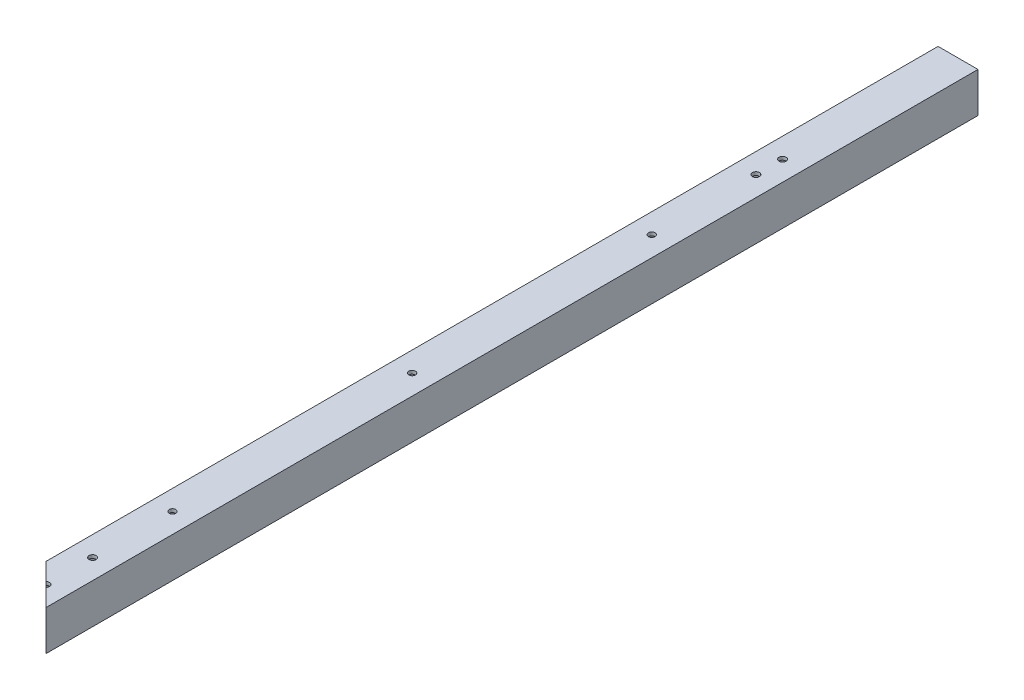
ISO-10303-21;
HEADER;
FILE_DESCRIPTION(('STEP AP214'),'2;1');
FILE_NAME('part.step','',(''),(''),'','','');
FILE_SCHEMA(('AUTOMOTIVE_DESIGN { 1 0 10303 214 1 1 1 1 }'));
ENDSEC;
DATA;
#1=APPLICATION_CONTEXT('core data for automotive mechanical design processes');
#2=APPLICATION_PROTOCOL_DEFINITION('international standard','automotive_design',2000,#1);
#3=PRODUCT_CONTEXT('',#1,'mechanical');
#4=PRODUCT('Part','Part','',(#3));
#5=PRODUCT_RELATED_PRODUCT_CATEGORY('part','',(#4));
#6=PRODUCT_DEFINITION_FORMATION('','',#4);
#7=PRODUCT_DEFINITION_CONTEXT('part definition',#1,'design');
#8=PRODUCT_DEFINITION('design','',#6,#7);
#9=PRODUCT_DEFINITION_SHAPE('','',#8);
#10=(LENGTH_UNIT() NAMED_UNIT(*) SI_UNIT(.MILLI.,.METRE.));
#11=(NAMED_UNIT(*) PLANE_ANGLE_UNIT() SI_UNIT($,.RADIAN.));
#12=(NAMED_UNIT(*) SI_UNIT($,.STERADIAN.) SOLID_ANGLE_UNIT());
#13=UNCERTAINTY_MEASURE_WITH_UNIT(LENGTH_MEASURE(1.E-05),#10,'distance_accuracy_value','');
#14=(GEOMETRIC_REPRESENTATION_CONTEXT(3) GLOBAL_UNCERTAINTY_ASSIGNED_CONTEXT((#13)) GLOBAL_UNIT_ASSIGNED_CONTEXT((#10,
#11,#12)) REPRESENTATION_CONTEXT('',''));
#15=CARTESIAN_POINT('',(0.,0.,0.));
#16=DIRECTION('',(0.,0.,1.));
#17=DIRECTION('',(1.,0.,0.));
#18=AXIS2_PLACEMENT_3D('',#15,#16,#17);
#19=CARTESIAN_POINT('',(-4.94626561931E-09,925.556360328166,349.25000000142));
#20=DIRECTION('',(0.,-1.,0.));
#21=DIRECTION('',(0.,0.,-1.));
#22=AXIS2_PLACEMENT_3D('',#19,#20,#21);
#23=CYLINDRICAL_SURFACE('',#22,3.3782);
#24=DIRECTION('',(0.,-1.,0.));
#25=VECTOR('',#24,1.);
#26=CARTESIAN_POINT('',(2.38874812620065,925.556360328166,351.638748126682));
#27=LINE('',#26,#25);
#28=CARTESIAN_POINT('',(2.38874812620065,38.1,351.638748126682));
#29=VERTEX_POINT('',#28);
#30=CARTESIAN_POINT('',(2.38874812620065,34.925,351.638748126682));
#31=VERTEX_POINT('',#30);
#32=EDGE_CURVE('E250',#29,#31,#27,.T.);
#33=ORIENTED_EDGE('',*,*,#32,.F.);
#34=CARTESIAN_POINT('',(-4.94626561931E-09,38.1,349.25000000142));
#35=DIRECTION('',(0.,-1.,0.));
#36=DIRECTION('',(0.,0.,-1.));
#37=AXIS2_PLACEMENT_3D('',#34,#35,#36);
#38=CIRCLE('',#37,3.3782);
#39=CARTESIAN_POINT('',(-2.3887481302771,38.1,346.861251870342));
#40=VERTEX_POINT('',#39);
#41=EDGE_CURVE('E35',#40,#29,#38,.T.);
#42=ORIENTED_EDGE('',*,*,#41,.F.);
#43=DIRECTION('',(0.,1.,0.));
#44=VECTOR('',#43,1.);
#45=CARTESIAN_POINT('',(-2.3887481302771,925.556360328166,346.861251870342));
#46=LINE('',#45,#44);
#47=CARTESIAN_POINT('',(-2.3887481302771,34.925,346.861251870342));
#48=VERTEX_POINT('',#47);
#49=EDGE_CURVE('E11',#48,#40,#46,.T.);
#50=ORIENTED_EDGE('',*,*,#49,.F.);
#51=CARTESIAN_POINT('',(-4.94626561931E-09,34.9250000000001,349.25000000142));
#52=DIRECTION('',(0.,1.,0.));
#53=DIRECTION('',(1.,0.,0.));
#54=AXIS2_PLACEMENT_3D('',#51,#52,#53);
#55=CIRCLE('',#54,3.3782);
#56=EDGE_CURVE('E256',#31,#48,#55,.T.);
#57=ORIENTED_EDGE('',*,*,#56,.F.);
#58=EDGE_LOOP('',(#33,#42,#50,#57));
#59=FACE_BOUND('',#58,.T.);
#60=ADVANCED_FACE('F16',(#59),#23,.F.);
#61=CARTESIAN_POINT('',(-4.94623009217321E-09,925.556360328166,304.800000001422));
#62=DIRECTION('',(0.,-1.,0.));
#63=DIRECTION('',(0.,0.,-1.));
#64=AXIS2_PLACEMENT_3D('',#61,#62,#63);
#65=CYLINDRICAL_SURFACE('',#64,3.3782);
#66=CARTESIAN_POINT('',(-4.94623009217321E-09,38.1,304.800000001422));
#67=DIRECTION('',(0.,-1.,0.));
#68=DIRECTION('',(0.,0.,-1.));
#69=AXIS2_PLACEMENT_3D('',#66,#67,#68);
#70=CIRCLE('',#69,3.3782);
#71=CARTESIAN_POINT('',(-4.94623009217321E-09,38.1,301.421800001422));
#72=VERTEX_POINT('',#71);
#73=EDGE_CURVE('E233',#72,#72,#70,.T.);
#74=ORIENTED_EDGE('',*,*,#73,.F.);
#75=EDGE_LOOP('',(#74));
#76=FACE_BOUND('',#75,.T.);
#77=CARTESIAN_POINT('',(-4.94623009217321E-09,34.9250000000001,304.800000001422));
#78=DIRECTION('',(0.,1.,0.));
#79=DIRECTION('',(1.,0.,0.));
#80=AXIS2_PLACEMENT_3D('',#77,#78,#79);
#81=CIRCLE('',#80,3.3782);
#82=CARTESIAN_POINT('',(3.37819999505377,34.9250000000001,304.800000001422));
#83=VERTEX_POINT('',#82);
#84=EDGE_CURVE('E203',#83,#83,#81,.T.);
#85=ORIENTED_EDGE('',*,*,#84,.F.);
#86=EDGE_LOOP('',(#85));
#87=FACE_BOUND('',#86,.T.);
#88=ADVANCED_FACE('F317',(#76,#87),#65,.F.);
#89=CARTESIAN_POINT('',(19.05,-0.00100000000000211,368.3));
#90=DIRECTION('',(0.707106781176342,0.,-0.707106781196753));
#91=DIRECTION('',(-0.707106781196753,0.,-0.707106781176342));
#92=AXIS2_PLACEMENT_3D('',#89,#90,#91);
#93=PLANE('',#92);
#94=ORIENTED_EDGE('',*,*,#49,.T.);
#95=DIRECTION('',(0.707106781196753,0.,0.707106781176342));
#96=VECTOR('',#95,1.);
#97=CARTESIAN_POINT('',(-77.7875000001375,38.1,271.462500002658));
#98=LINE('',#97,#96);
#99=CARTESIAN_POINT('',(-19.05,38.1,330.2000000011));
#100=VERTEX_POINT('',#99);
#101=EDGE_CURVE('E124',#100,#40,#98,.T.);
#102=ORIENTED_EDGE('',*,*,#101,.F.);
#103=DIRECTION('',(0.,1.,0.));
#104=VECTOR('',#103,1.);
#105=CARTESIAN_POINT('',(-19.05,-0.000500000000001055,330.2000000011));
#106=LINE('',#105,#104);
#107=CARTESIAN_POINT('',(-19.05,0.,330.2000000011));
#108=VERTEX_POINT('',#107);
#109=EDGE_CURVE('E253',#108,#100,#106,.T.);
#110=ORIENTED_EDGE('',*,*,#109,.F.);
#111=DIRECTION('',(-0.707106781196753,0.,-0.707106781176342));
#112=VECTOR('',#111,1.);
#113=CARTESIAN_POINT('',(-77.7875000001375,0.,271.462500002658));
#114=LINE('',#113,#112);
#115=CARTESIAN_POINT('',(-2.38874813027705,0.,346.861251870342));
#116=VERTEX_POINT('',#115);
#117=EDGE_CURVE('E190',#116,#108,#114,.T.);
#118=ORIENTED_EDGE('',*,*,#117,.F.);
#119=DIRECTION('',(0.,1.,0.));
#120=VECTOR('',#119,1.);
#121=CARTESIAN_POINT('',(-2.38874813027705,890.631360328166,346.861251870342));
#122=LINE('',#121,#120);
#123=CARTESIAN_POINT('',(-2.38874813027705,3.17499999999995,346.861251870342));
#124=VERTEX_POINT('',#123);
#125=EDGE_CURVE('E26',#116,#124,#122,.T.);
#126=ORIENTED_EDGE('',*,*,#125,.T.);
#127=DIRECTION('',(0.707106781196753,0.,0.707106781176342));
#128=VECTOR('',#127,1.);
#129=CARTESIAN_POINT('',(-77.7875000001375,3.175,271.462500002658));
#130=LINE('',#129,#128);
#131=CARTESIAN_POINT('',(-15.875,3.175,333.375000001008));
#132=VERTEX_POINT('',#131);
#133=EDGE_CURVE('E148',#132,#124,#130,.T.);
#134=ORIENTED_EDGE('',*,*,#133,.F.);
#135=DIRECTION('',(0.,-1.,0.));
#136=VECTOR('',#135,1.);
#137=CARTESIAN_POINT('',(-15.875,-0.000500000000001055,333.375000001008));
#138=LINE('',#137,#136);
#139=CARTESIAN_POINT('',(-15.875,34.925,333.375000001008));
#140=VERTEX_POINT('',#139);
#141=EDGE_CURVE('E143',#140,#132,#138,.T.);
#142=ORIENTED_EDGE('',*,*,#141,.F.);
#143=DIRECTION('',(-0.707106781196753,0.,-0.707106781176342));
#144=VECTOR('',#143,1.);
#145=CARTESIAN_POINT('',(-77.7875000001375,34.925,271.462500002658));
#146=LINE('',#145,#144);
#147=EDGE_CURVE('E259',#48,#140,#146,.T.);
#148=ORIENTED_EDGE('',*,*,#147,.F.);
#149=EDGE_LOOP('',(#94,#102,#110,#118,#126,#134,#142,#148));
#150=FACE_BOUND('',#149,.T.);
#151=ADVANCED_FACE('F323',(#150),#93,.F.);
#152=CARTESIAN_POINT('',(0.,34.925,0.));
#153=DIRECTION('',(0.,1.,0.));
#154=DIRECTION('',(0.,0.,1.));
#155=AXIS2_PLACEMENT_3D('',#152,#153,#154);
#156=PLANE('',#155);
#157=CARTESIAN_POINT('',(0.,34.925,-228.6));
#158=DIRECTION('',(0.,1.,0.));
#159=DIRECTION('',(1.,0.,0.));
#160=AXIS2_PLACEMENT_3D('',#157,#158,#159);
#161=CIRCLE('',#160,3.175);
#162=CARTESIAN_POINT('',(3.175,34.925,-228.6));
#163=VERTEX_POINT('',#162);
#164=EDGE_CURVE('E272',#163,#163,#161,.T.);
#165=ORIENTED_EDGE('',*,*,#164,.T.);
#166=EDGE_LOOP('',(#165));
#167=FACE_BOUND('',#166,.T.);
#168=CARTESIAN_POINT('',(0.,34.925,0.));
#169=DIRECTION('',(0.,1.,0.));
#170=DIRECTION('',(1.,0.,0.));
#171=AXIS2_PLACEMENT_3D('',#168,#169,#170);
#172=CIRCLE('',#171,3.175);
#173=CARTESIAN_POINT('',(3.175,34.925,0.));
#174=VERTEX_POINT('',#173);
#175=EDGE_CURVE('E279',#174,#174,#172,.T.);
#176=ORIENTED_EDGE('',*,*,#175,.T.);
#177=EDGE_LOOP('',(#176));
#178=FACE_BOUND('',#177,.T.);
#179=CARTESIAN_POINT('',(0.,34.925,228.6));
#180=DIRECTION('',(0.,1.,0.));
#181=DIRECTION('',(1.,0.,0.));
#182=AXIS2_PLACEMENT_3D('',#179,#180,#181);
#183=CIRCLE('',#182,3.175);
#184=CARTESIAN_POINT('',(3.175,34.925,228.6));
#185=VERTEX_POINT('',#184);
#186=EDGE_CURVE('E258',#185,#185,#183,.T.);
#187=ORIENTED_EDGE('',*,*,#186,.T.);
#188=EDGE_LOOP('',(#187));
#189=FACE_BOUND('',#188,.T.);
#190=ORIENTED_EDGE('',*,*,#56,.T.);
#191=ORIENTED_EDGE('',*,*,#147,.T.);
#192=DIRECTION('',(0.,0.,-1.));
#193=VECTOR('',#192,1.);
#194=CARTESIAN_POINT('',(-15.875,34.925,-241.3));
#195=LINE('',#194,#193);
#196=CARTESIAN_POINT('',(-15.875,34.925,-520.7));
#197=VERTEX_POINT('',#196);
#198=EDGE_CURVE('E276',#140,#197,#195,.T.);
#199=ORIENTED_EDGE('',*,*,#198,.T.);
#200=DIRECTION('',(-1.,0.,0.));
#201=VECTOR('',#200,1.);
#202=CARTESIAN_POINT('',(-7.9375,34.925,-520.7));
#203=LINE('',#202,#201);
#204=CARTESIAN_POINT('',(15.875,34.925,-520.7));
#205=VERTEX_POINT('',#204);
#206=EDGE_CURVE('E242',#205,#197,#203,.T.);
#207=ORIENTED_EDGE('',*,*,#206,.F.);
#208=DIRECTION('',(0.,0.,-1.));
#209=VECTOR('',#208,1.);
#210=CARTESIAN_POINT('',(15.875,34.925,-241.3));
#211=LINE('',#210,#209);
#212=CARTESIAN_POINT('',(15.875,34.925,365.125000000092));
#213=VERTEX_POINT('',#212);
#214=EDGE_CURVE('E118',#213,#205,#211,.T.);
#215=ORIENTED_EDGE('',*,*,#214,.F.);
#216=DIRECTION('',(-0.707106781196753,0.,-0.707106781176342));
#217=VECTOR('',#216,1.);
#218=CARTESIAN_POINT('',(-77.7875000001375,34.925,271.462500002658));
#219=LINE('',#218,#217);
#220=EDGE_CURVE('E286',#213,#31,#219,.T.);
#221=ORIENTED_EDGE('',*,*,#220,.T.);
#222=EDGE_LOOP('',(#190,#191,#199,#207,#215,#221));
#223=FACE_BOUND('',#222,.T.);
#224=CARTESIAN_POINT('',(9.59232693276135E-13,34.9250000000001,-353.309418013349));
#225=DIRECTION('',(0.,1.,0.));
#226=DIRECTION('',(1.,0.,0.));
#227=AXIS2_PLACEMENT_3D('',#224,#225,#226);
#228=CIRCLE('',#227,3.3782);
#229=CARTESIAN_POINT('',(3.37820000000096,34.9250000000001,-353.309418013349));
#230=VERTEX_POINT('',#229);
#231=EDGE_CURVE('E290',#230,#230,#228,.T.);
#232=ORIENTED_EDGE('',*,*,#231,.T.);
#233=EDGE_LOOP('',(#232));
#234=FACE_BOUND('',#233,.T.);
#235=CARTESIAN_POINT('',(9.59232693276135E-13,34.9250000000001,-327.909418013351));
#236=DIRECTION('',(0.,1.,0.));
#237=DIRECTION('',(1.,0.,0.));
#238=AXIS2_PLACEMENT_3D('',#235,#236,#237);
#239=CIRCLE('',#238,3.3782);
#240=CARTESIAN_POINT('',(3.37820000000096,34.9250000000001,-327.909418013351));
#241=VERTEX_POINT('',#240);
#242=EDGE_CURVE('E264',#241,#241,#239,.T.);
#243=ORIENTED_EDGE('',*,*,#242,.T.);
#244=EDGE_LOOP('',(#243));
#245=FACE_BOUND('',#244,.T.);
#246=ORIENTED_EDGE('',*,*,#84,.T.);
#247=EDGE_LOOP('',(#246));
#248=FACE_BOUND('',#247,.T.);
#249=ADVANCED_FACE('F295',(#167,#178,#189,#223,#234,#245,#248),#156,.F.);
#250=CARTESIAN_POINT('',(-4.94626561931E-09,890.631360328166,349.25000000142));
#251=DIRECTION('',(0.,-1.,0.));
#252=DIRECTION('',(0.,0.,-1.));
#253=AXIS2_PLACEMENT_3D('',#250,#251,#252);
#254=CYLINDRICAL_SURFACE('',#253,3.3782);
#255=DIRECTION('',(0.,-1.,0.));
#256=VECTOR('',#255,1.);
#257=CARTESIAN_POINT('',(2.3887481262007,890.631360328166,351.638748126682));
#258=LINE('',#257,#256);
#259=CARTESIAN_POINT('',(2.3887481262007,3.17499999999995,351.638748126682));
#260=VERTEX_POINT('',#259);
#261=CARTESIAN_POINT('',(2.3887481262007,0.,351.638748126682));
#262=VERTEX_POINT('',#261);
#263=EDGE_CURVE('E184',#260,#262,#258,.T.);
#264=ORIENTED_EDGE('',*,*,#263,.F.);
#265=CARTESIAN_POINT('',(-4.94626561931E-09,3.17499999999995,349.25000000142));
#266=DIRECTION('',(0.,-1.,0.));
#267=DIRECTION('',(0.,0.,-1.));
#268=AXIS2_PLACEMENT_3D('',#265,#266,#267);
#269=CIRCLE('',#268,3.3782);
#270=EDGE_CURVE('E175',#124,#260,#269,.T.);
#271=ORIENTED_EDGE('',*,*,#270,.F.);
#272=ORIENTED_EDGE('',*,*,#125,.F.);
#273=CARTESIAN_POINT('',(-4.94626561931E-09,0.,349.25000000142));
#274=DIRECTION('',(0.,1.,0.));
#275=DIRECTION('',(1.,0.,0.));
#276=AXIS2_PLACEMENT_3D('',#273,#274,#275);
#277=CIRCLE('',#276,3.3782);
#278=EDGE_CURVE('E186',#262,#116,#277,.T.);
#279=ORIENTED_EDGE('',*,*,#278,.F.);
#280=EDGE_LOOP('',(#264,#271,#272,#279));
#281=FACE_BOUND('',#280,.T.);
#282=ADVANCED_FACE('F332',(#281),#254,.F.);
#283=CARTESIAN_POINT('',(-4.94623009217321E-09,890.631360328166,304.800000001422));
#284=DIRECTION('',(0.,-1.,0.));
#285=DIRECTION('',(0.,0.,-1.));
#286=AXIS2_PLACEMENT_3D('',#283,#284,#285);
#287=CYLINDRICAL_SURFACE('',#286,3.3782);
#288=CARTESIAN_POINT('',(-4.94623009217321E-09,3.17499999999995,304.800000001422));
#289=DIRECTION('',(0.,-1.,0.));
#290=DIRECTION('',(0.,0.,-1.));
#291=AXIS2_PLACEMENT_3D('',#288,#289,#290);
#292=CIRCLE('',#291,3.3782);
#293=CARTESIAN_POINT('',(-4.94623009217321E-09,3.17499999999995,301.421800001422));
#294=VERTEX_POINT('',#293);
#295=EDGE_CURVE('E191',#294,#294,#292,.T.);
#296=ORIENTED_EDGE('',*,*,#295,.F.);
#297=EDGE_LOOP('',(#296));
#298=FACE_BOUND('',#297,.T.);
#299=CARTESIAN_POINT('',(-4.94623009217321E-09,0.,304.800000001422));
#300=DIRECTION('',(0.,1.,0.));
#301=DIRECTION('',(1.,0.,0.));
#302=AXIS2_PLACEMENT_3D('',#299,#300,#301);
#303=CIRCLE('',#302,3.3782);
#304=CARTESIAN_POINT('',(3.37819999505377,0.,304.800000001422));
#305=VERTEX_POINT('',#304);
#306=EDGE_CURVE('E195',#305,#305,#303,.T.);
#307=ORIENTED_EDGE('',*,*,#306,.F.);
#308=EDGE_LOOP('',(#307));
#309=FACE_BOUND('',#308,.T.);
#310=ADVANCED_FACE('F312',(#298,#309),#287,.F.);
#311=CARTESIAN_POINT('',(0.,0.,0.));
#312=DIRECTION('',(0.,1.,0.));
#313=DIRECTION('',(0.,0.,1.));
#314=AXIS2_PLACEMENT_3D('',#311,#312,#313);
#315=PLANE('',#314);
#316=CARTESIAN_POINT('',(0.,0.,228.6));
#317=DIRECTION('',(0.,1.,0.));
#318=DIRECTION('',(1.,0.,0.));
#319=AXIS2_PLACEMENT_3D('',#316,#317,#318);
#320=CIRCLE('',#319,3.175);
#321=CARTESIAN_POINT('',(3.175,0.,228.6));
#322=VERTEX_POINT('',#321);
#323=EDGE_CURVE('E200',#322,#322,#320,.T.);
#324=ORIENTED_EDGE('',*,*,#323,.T.);
#325=EDGE_LOOP('',(#324));
#326=FACE_BOUND('',#325,.T.);
#327=CARTESIAN_POINT('',(0.,0.,114.3));
#328=DIRECTION('',(0.,1.,0.));
#329=DIRECTION('',(1.,0.,0.));
#330=AXIS2_PLACEMENT_3D('',#327,#328,#329);
#331=CIRCLE('',#330,3.175);
#332=CARTESIAN_POINT('',(3.175,0.,114.3));
#333=VERTEX_POINT('',#332);
#334=EDGE_CURVE('E204',#333,#333,#331,.T.);
#335=ORIENTED_EDGE('',*,*,#334,.T.);
#336=EDGE_LOOP('',(#335));
#337=FACE_BOUND('',#336,.T.);
#338=CARTESIAN_POINT('',(0.,0.,0.));
#339=DIRECTION('',(0.,1.,0.));
#340=DIRECTION('',(1.,0.,0.));
#341=AXIS2_PLACEMENT_3D('',#338,#339,#340);
#342=CIRCLE('',#341,3.175);
#343=CARTESIAN_POINT('',(3.175,0.,0.));
#344=VERTEX_POINT('',#343);
#345=EDGE_CURVE('E207',#344,#344,#342,.T.);
#346=ORIENTED_EDGE('',*,*,#345,.T.);
#347=EDGE_LOOP('',(#346));
#348=FACE_BOUND('',#347,.T.);
#349=CARTESIAN_POINT('',(0.,0.,-114.3));
#350=DIRECTION('',(0.,1.,0.));
#351=DIRECTION('',(1.,0.,0.));
#352=AXIS2_PLACEMENT_3D('',#349,#350,#351);
#353=CIRCLE('',#352,3.175);
#354=CARTESIAN_POINT('',(3.175,0.,-114.3));
#355=VERTEX_POINT('',#354);
#356=EDGE_CURVE('E210',#355,#355,#353,.T.);
#357=ORIENTED_EDGE('',*,*,#356,.T.);
#358=EDGE_LOOP('',(#357));
#359=FACE_BOUND('',#358,.T.);
#360=CARTESIAN_POINT('',(0.,0.,-228.6));
#361=DIRECTION('',(0.,1.,0.));
#362=DIRECTION('',(1.,0.,0.));
#363=AXIS2_PLACEMENT_3D('',#360,#361,#362);
#364=CIRCLE('',#363,3.175);
#365=CARTESIAN_POINT('',(3.175,0.,-228.6));
#366=VERTEX_POINT('',#365);
#367=EDGE_CURVE('E189',#366,#366,#364,.T.);
#368=ORIENTED_EDGE('',*,*,#367,.T.);
#369=EDGE_LOOP('',(#368));
#370=FACE_BOUND('',#369,.T.);
#371=ORIENTED_EDGE('',*,*,#278,.T.);
#372=ORIENTED_EDGE('',*,*,#117,.T.);
#373=DIRECTION('',(0.,0.,-1.));
#374=VECTOR('',#373,1.);
#375=CARTESIAN_POINT('',(-19.05,0.,241.3));
#376=LINE('',#375,#374);
#377=CARTESIAN_POINT('',(-19.05,0.,-520.7));
#378=VERTEX_POINT('',#377);
#379=EDGE_CURVE('E215',#108,#378,#376,.T.);
#380=ORIENTED_EDGE('',*,*,#379,.T.);
#381=DIRECTION('',(-1.,0.,0.));
#382=VECTOR('',#381,1.);
#383=CARTESIAN_POINT('',(19.05,0.,-520.7));
#384=LINE('',#383,#382);
#385=CARTESIAN_POINT('',(19.05,0.,-520.7));
#386=VERTEX_POINT('',#385);
#387=EDGE_CURVE('E219',#386,#378,#384,.T.);
#388=ORIENTED_EDGE('',*,*,#387,.F.);
#389=DIRECTION('',(0.,0.,1.));
#390=VECTOR('',#389,1.);
#391=CARTESIAN_POINT('',(19.05,0.,241.3));
#392=LINE('',#391,#390);
#393=CARTESIAN_POINT('',(19.05,0.,368.3));
#394=VERTEX_POINT('',#393);
#395=EDGE_CURVE('E218',#386,#394,#392,.T.);
#396=ORIENTED_EDGE('',*,*,#395,.T.);
#397=DIRECTION('',(-0.707106781196753,0.,-0.707106781176342));
#398=VECTOR('',#397,1.);
#399=CARTESIAN_POINT('',(-77.7875000001375,0.,271.462500002658));
#400=LINE('',#399,#398);
#401=EDGE_CURVE('E113',#394,#262,#400,.T.);
#402=ORIENTED_EDGE('',*,*,#401,.T.);
#403=EDGE_LOOP('',(#371,#372,#380,#388,#396,#402));
#404=FACE_BOUND('',#403,.T.);
#405=CARTESIAN_POINT('',(9.59232693276135E-13,0.,-353.309418013349));
#406=DIRECTION('',(0.,1.,0.));
#407=DIRECTION('',(1.,0.,0.));
#408=AXIS2_PLACEMENT_3D('',#405,#406,#407);
#409=CIRCLE('',#408,3.3782);
#410=CARTESIAN_POINT('',(3.37820000000096,0.,-353.309418013349));
#411=VERTEX_POINT('',#410);
#412=EDGE_CURVE('E225',#411,#411,#409,.T.);
#413=ORIENTED_EDGE('',*,*,#412,.T.);
#414=EDGE_LOOP('',(#413));
#415=FACE_BOUND('',#414,.T.);
#416=CARTESIAN_POINT('',(9.59232693276135E-13,0.,-327.909418013351));
#417=DIRECTION('',(0.,1.,0.));
#418=DIRECTION('',(1.,0.,0.));
#419=AXIS2_PLACEMENT_3D('',#416,#417,#418);
#420=CIRCLE('',#419,3.3782);
#421=CARTESIAN_POINT('',(3.37820000000096,0.,-327.909418013351));
#422=VERTEX_POINT('',#421);
#423=EDGE_CURVE('E198',#422,#422,#420,.T.);
#424=ORIENTED_EDGE('',*,*,#423,.T.);
#425=EDGE_LOOP('',(#424));
#426=FACE_BOUND('',#425,.T.);
#427=ORIENTED_EDGE('',*,*,#306,.T.);
#428=EDGE_LOOP('',(#427));
#429=FACE_BOUND('',#428,.T.);
#430=ADVANCED_FACE('F301',(#326,#337,#348,#359,#370,#404,#415,#426,#429),#315,.F.);
#431=CARTESIAN_POINT('',(9.59232693276135E-13,925.556360328166,-327.909418013351));
#432=DIRECTION('',(0.,-1.,0.));
#433=DIRECTION('',(0.,0.,-1.));
#434=AXIS2_PLACEMENT_3D('',#431,#432,#433);
#435=CYLINDRICAL_SURFACE('',#434,3.3782);
#436=CARTESIAN_POINT('',(9.59232693276135E-13,38.1,-327.909418013351));
#437=DIRECTION('',(0.,-1.,0.));
#438=DIRECTION('',(0.,0.,-1.));
#439=AXIS2_PLACEMENT_3D('',#436,#437,#438);
#440=CIRCLE('',#439,3.3782);
#441=CARTESIAN_POINT('',(9.59232693276135E-13,38.1,-331.287618013351));
#442=VERTEX_POINT('',#441);
#443=EDGE_CURVE('E230',#442,#442,#440,.T.);
#444=ORIENTED_EDGE('',*,*,#443,.F.);
#445=EDGE_LOOP('',(#444));
#446=FACE_BOUND('',#445,.T.);
#447=ORIENTED_EDGE('',*,*,#242,.F.);
#448=EDGE_LOOP('',(#447));
#449=FACE_BOUND('',#448,.T.);
#450=ADVANCED_FACE('F298',(#446,#449),#435,.F.);
#451=CARTESIAN_POINT('',(9.59232693276135E-13,925.556360328166,-353.309418013349));
#452=DIRECTION('',(0.,-1.,0.));
#453=DIRECTION('',(0.,0.,-1.));
#454=AXIS2_PLACEMENT_3D('',#451,#452,#453);
#455=CYLINDRICAL_SURFACE('',#454,3.3782);
#456=CARTESIAN_POINT('',(9.59232693276135E-13,38.1,-353.309418013349));
#457=DIRECTION('',(0.,-1.,0.));
#458=DIRECTION('',(0.,0.,-1.));
#459=AXIS2_PLACEMENT_3D('',#456,#457,#458);
#460=CIRCLE('',#459,3.3782);
#461=CARTESIAN_POINT('',(9.59232693276135E-13,38.1,-356.687618013349));
#462=VERTEX_POINT('',#461);
#463=EDGE_CURVE('E136',#462,#462,#460,.T.);
#464=ORIENTED_EDGE('',*,*,#463,.F.);
#465=EDGE_LOOP('',(#464));
#466=FACE_BOUND('',#465,.T.);
#467=ORIENTED_EDGE('',*,*,#231,.F.);
#468=EDGE_LOOP('',(#467));
#469=FACE_BOUND('',#468,.T.);
#470=ADVANCED_FACE('F300',(#466,#469),#455,.F.);
#471=CARTESIAN_POINT('',(9.59232693276135E-13,890.631360328166,-327.909418013351));
#472=DIRECTION('',(0.,-1.,0.));
#473=DIRECTION('',(0.,0.,-1.));
#474=AXIS2_PLACEMENT_3D('',#471,#472,#473);
#475=CYLINDRICAL_SURFACE('',#474,3.3782);
#476=CARTESIAN_POINT('',(9.59232693276135E-13,3.17499999999995,-327.909418013351));
#477=DIRECTION('',(0.,-1.,0.));
#478=DIRECTION('',(0.,0.,-1.));
#479=AXIS2_PLACEMENT_3D('',#476,#477,#478);
#480=CIRCLE('',#479,3.3782);
#481=CARTESIAN_POINT('',(9.59232693276135E-13,3.17499999999995,-331.287618013351));
#482=VERTEX_POINT('',#481);
#483=EDGE_CURVE('E194',#482,#482,#480,.T.);
#484=ORIENTED_EDGE('',*,*,#483,.F.);
#485=EDGE_LOOP('',(#484));
#486=FACE_BOUND('',#485,.T.);
#487=ORIENTED_EDGE('',*,*,#423,.F.);
#488=EDGE_LOOP('',(#487));
#489=FACE_BOUND('',#488,.T.);
#490=ADVANCED_FACE('F309',(#486,#489),#475,.F.);
#491=CARTESIAN_POINT('',(9.59232693276135E-13,890.631360328166,-353.309418013349));
#492=DIRECTION('',(0.,-1.,0.));
#493=DIRECTION('',(0.,0.,-1.));
#494=AXIS2_PLACEMENT_3D('',#491,#492,#493);
#495=CYLINDRICAL_SURFACE('',#494,3.3782);
#496=CARTESIAN_POINT('',(9.59232693276135E-13,3.17499999999995,-353.309418013349));
#497=DIRECTION('',(0.,-1.,0.));
#498=DIRECTION('',(0.,0.,-1.));
#499=AXIS2_PLACEMENT_3D('',#496,#497,#498);
#500=CIRCLE('',#499,3.3782);
#501=CARTESIAN_POINT('',(9.59232693276135E-13,3.17499999999995,-356.687618013349));
#502=VERTEX_POINT('',#501);
#503=EDGE_CURVE('E155',#502,#502,#500,.T.);
#504=ORIENTED_EDGE('',*,*,#503,.F.);
#505=EDGE_LOOP('',(#504));
#506=FACE_BOUND('',#505,.T.);
#507=ORIENTED_EDGE('',*,*,#412,.F.);
#508=EDGE_LOOP('',(#507));
#509=FACE_BOUND('',#508,.T.);
#510=ADVANCED_FACE('F428',(#506,#509),#495,.F.);
#511=CARTESIAN_POINT('',(0.,19.05,-520.7));
#512=DIRECTION('',(0.,0.,1.));
#513=DIRECTION('',(1.,0.,0.));
#514=AXIS2_PLACEMENT_3D('',#511,#512,#513);
#515=PLANE('',#514);
#516=DIRECTION('',(0.,1.,0.));
#517=VECTOR('',#516,1.);
#518=CARTESIAN_POINT('',(15.875,26.9875,-520.7));
#519=LINE('',#518,#517);
#520=CARTESIAN_POINT('',(15.875,3.175,-520.7));
#521=VERTEX_POINT('',#520);
#522=EDGE_CURVE('E199',#521,#205,#519,.T.);
#523=ORIENTED_EDGE('',*,*,#522,.T.);
#524=ORIENTED_EDGE('',*,*,#206,.T.);
#525=DIRECTION('',(0.,-1.,0.));
#526=VECTOR('',#525,1.);
#527=CARTESIAN_POINT('',(-15.875,11.1125,-520.7));
#528=LINE('',#527,#526);
#529=CARTESIAN_POINT('',(-15.875,3.175,-520.7));
#530=VERTEX_POINT('',#529);
#531=EDGE_CURVE('E243',#197,#530,#528,.T.);
#532=ORIENTED_EDGE('',*,*,#531,.T.);
#533=DIRECTION('',(1.,0.,0.));
#534=VECTOR('',#533,1.);
#535=CARTESIAN_POINT('',(7.9375,3.175,-520.7));
#536=LINE('',#535,#534);
#537=EDGE_CURVE('E221',#530,#521,#536,.T.);
#538=ORIENTED_EDGE('',*,*,#537,.T.);
#539=EDGE_LOOP('',(#523,#524,#532,#538));
#540=FACE_BOUND('',#539,.T.);
#541=ORIENTED_EDGE('',*,*,#387,.T.);
#542=DIRECTION('',(0.,1.,0.));
#543=VECTOR('',#542,1.);
#544=CARTESIAN_POINT('',(-19.05,0.,-520.7));
#545=LINE('',#544,#543);
#546=CARTESIAN_POINT('',(-19.05,38.1,-520.7));
#547=VERTEX_POINT('',#546);
#548=EDGE_CURVE('E222',#378,#547,#545,.T.);
#549=ORIENTED_EDGE('',*,*,#548,.T.);
#550=DIRECTION('',(1.,0.,0.));
#551=VECTOR('',#550,1.);
#552=CARTESIAN_POINT('',(-19.05,38.1,-520.7));
#553=LINE('',#552,#551);
#554=CARTESIAN_POINT('',(19.05,38.1,-520.7));
#555=VERTEX_POINT('',#554);
#556=EDGE_CURVE('E248',#547,#555,#553,.T.);
#557=ORIENTED_EDGE('',*,*,#556,.T.);
#558=DIRECTION('',(0.,-1.,0.));
#559=VECTOR('',#558,1.);
#560=CARTESIAN_POINT('',(19.05,38.1,-520.7));
#561=LINE('',#560,#559);
#562=EDGE_CURVE('E127',#555,#386,#561,.T.);
#563=ORIENTED_EDGE('',*,*,#562,.T.);
#564=EDGE_LOOP('',(#541,#549,#557,#563));
#565=FACE_BOUND('',#564,.T.);
#566=ADVANCED_FACE('F425',(#540,#565),#515,.F.);
#567=CARTESIAN_POINT('',(19.05,-0.00100000000000211,368.3));
#568=DIRECTION('',(0.707106781176342,0.,-0.707106781196753));
#569=DIRECTION('',(-0.707106781196753,0.,-0.707106781176342));
#570=AXIS2_PLACEMENT_3D('',#567,#568,#569);
#571=PLANE('',#570);
#572=ORIENTED_EDGE('',*,*,#32,.T.);
#573=ORIENTED_EDGE('',*,*,#220,.F.);
#574=DIRECTION('',(0.,1.,0.));
#575=VECTOR('',#574,1.);
#576=CARTESIAN_POINT('',(15.875,-0.000500000000001055,365.125000000092));
#577=LINE('',#576,#575);
#578=CARTESIAN_POINT('',(15.875,3.175,365.125000000092));
#579=VERTEX_POINT('',#578);
#580=EDGE_CURVE('E104',#579,#213,#577,.T.);
#581=ORIENTED_EDGE('',*,*,#580,.F.);
#582=DIRECTION('',(0.707106781196753,0.,0.707106781176342));
#583=VECTOR('',#582,1.);
#584=CARTESIAN_POINT('',(-77.7875000001375,3.175,271.462500002658));
#585=LINE('',#584,#583);
#586=EDGE_CURVE('E151',#260,#579,#585,.T.);
#587=ORIENTED_EDGE('',*,*,#586,.F.);
#588=ORIENTED_EDGE('',*,*,#263,.T.);
#589=ORIENTED_EDGE('',*,*,#401,.F.);
#590=DIRECTION('',(0.,-1.,0.));
#591=VECTOR('',#590,1.);
#592=CARTESIAN_POINT('',(19.05,-0.000500000000001055,368.3));
#593=LINE('',#592,#591);
#594=CARTESIAN_POINT('',(19.05,38.1,368.3));
#595=VERTEX_POINT('',#594);
#596=EDGE_CURVE('E109',#595,#394,#593,.T.);
#597=ORIENTED_EDGE('',*,*,#596,.F.);
#598=DIRECTION('',(0.707106781196753,0.,0.707106781176342));
#599=VECTOR('',#598,1.);
#600=CARTESIAN_POINT('',(-77.7875000001375,38.1,271.462500002658));
#601=LINE('',#600,#599);
#602=EDGE_CURVE('E111',#29,#595,#601,.T.);
#603=ORIENTED_EDGE('',*,*,#602,.F.);
#604=EDGE_LOOP('',(#572,#573,#581,#587,#588,#589,#597,#603));
#605=FACE_BOUND('',#604,.T.);
#606=ADVANCED_FACE('F110',(#605),#571,.F.);
#607=CARTESIAN_POINT('',(-19.05,0.,-241.3));
#608=DIRECTION('',(-1.,0.,0.));
#609=DIRECTION('',(0.,0.,1.));
#610=AXIS2_PLACEMENT_3D('',#607,#608,#609);
#611=PLANE('',#610);
#612=ORIENTED_EDGE('',*,*,#109,.T.);
#613=DIRECTION('',(0.,0.,-1.));
#614=VECTOR('',#613,1.);
#615=CARTESIAN_POINT('',(-19.05,38.1,-241.3));
#616=LINE('',#615,#614);
#617=EDGE_CURVE('E132',#100,#547,#616,.T.);
#618=ORIENTED_EDGE('',*,*,#617,.T.);
#619=ORIENTED_EDGE('',*,*,#548,.F.);
#620=ORIENTED_EDGE('',*,*,#379,.F.);
#621=EDGE_LOOP('',(#612,#618,#619,#620));
#622=FACE_BOUND('',#621,.T.);
#623=ADVANCED_FACE('F399',(#622),#611,.T.);
#624=CARTESIAN_POINT('',(0.,38.1,0.));
#625=DIRECTION('',(0.,1.,0.));
#626=DIRECTION('',(0.,0.,1.));
#627=AXIS2_PLACEMENT_3D('',#624,#625,#626);
#628=PLANE('',#627);
#629=ORIENTED_EDGE('',*,*,#41,.T.);
#630=ORIENTED_EDGE('',*,*,#602,.T.);
#631=DIRECTION('',(0.,0.,1.));
#632=VECTOR('',#631,1.);
#633=CARTESIAN_POINT('',(19.05,38.1,241.3));
#634=LINE('',#633,#632);
#635=EDGE_CURVE('E119',#555,#595,#634,.T.);
#636=ORIENTED_EDGE('',*,*,#635,.F.);
#637=ORIENTED_EDGE('',*,*,#556,.F.);
#638=ORIENTED_EDGE('',*,*,#617,.F.);
#639=ORIENTED_EDGE('',*,*,#101,.T.);
#640=EDGE_LOOP('',(#629,#630,#636,#637,#638,#639));
#641=FACE_BOUND('',#640,.T.);
#642=ORIENTED_EDGE('',*,*,#73,.T.);
#643=EDGE_LOOP('',(#642));
#644=FACE_BOUND('',#643,.T.);
#645=ORIENTED_EDGE('',*,*,#443,.T.);
#646=EDGE_LOOP('',(#645));
#647=FACE_BOUND('',#646,.T.);
#648=ORIENTED_EDGE('',*,*,#463,.T.);
#649=EDGE_LOOP('',(#648));
#650=FACE_BOUND('',#649,.T.);
#651=CARTESIAN_POINT('',(0.,38.1,-228.6));
#652=DIRECTION('',(0.,-1.,0.));
#653=DIRECTION('',(0.,0.,-1.));
#654=AXIS2_PLACEMENT_3D('',#651,#652,#653);
#655=CIRCLE('',#654,3.175);
#656=CARTESIAN_POINT('',(0.,38.1,-231.775));
#657=VERTEX_POINT('',#656);
#658=EDGE_CURVE('E133',#657,#657,#655,.T.);
#659=ORIENTED_EDGE('',*,*,#658,.T.);
#660=EDGE_LOOP('',(#659));
#661=FACE_BOUND('',#660,.T.);
#662=CARTESIAN_POINT('',(0.,38.1,0.));
#663=DIRECTION('',(0.,-1.,0.));
#664=DIRECTION('',(0.,0.,-1.));
#665=AXIS2_PLACEMENT_3D('',#662,#663,#664);
#666=CIRCLE('',#665,3.175);
#667=CARTESIAN_POINT('',(0.,38.1,-3.175));
#668=VERTEX_POINT('',#667);
#669=EDGE_CURVE('E137',#668,#668,#666,.T.);
#670=ORIENTED_EDGE('',*,*,#669,.T.);
#671=EDGE_LOOP('',(#670));
#672=FACE_BOUND('',#671,.T.);
#673=CARTESIAN_POINT('',(0.,38.1,228.6));
#674=DIRECTION('',(0.,-1.,0.));
#675=DIRECTION('',(0.,0.,-1.));
#676=AXIS2_PLACEMENT_3D('',#673,#674,#675);
#677=CIRCLE('',#676,3.175);
#678=CARTESIAN_POINT('',(0.,38.1,225.425));
#679=VERTEX_POINT('',#678);
#680=EDGE_CURVE('E140',#679,#679,#677,.T.);
#681=ORIENTED_EDGE('',*,*,#680,.T.);
#682=EDGE_LOOP('',(#681));
#683=FACE_BOUND('',#682,.T.);
#684=ADVANCED_FACE('F122',(#641,#644,#647,#650,#661,#672,#683),#628,.T.);
#685=CARTESIAN_POINT('',(-15.875,0.,-241.3));
#686=DIRECTION('',(-1.,0.,0.));
#687=DIRECTION('',(0.,0.,1.));
#688=AXIS2_PLACEMENT_3D('',#685,#686,#687);
#689=PLANE('',#688);
#690=ORIENTED_EDGE('',*,*,#141,.T.);
#691=DIRECTION('',(0.,0.,1.));
#692=VECTOR('',#691,1.);
#693=CARTESIAN_POINT('',(-15.875,3.175,241.3));
#694=LINE('',#693,#692);
#695=EDGE_CURVE('E144',#530,#132,#694,.T.);
#696=ORIENTED_EDGE('',*,*,#695,.F.);
#697=ORIENTED_EDGE('',*,*,#531,.F.);
#698=ORIENTED_EDGE('',*,*,#198,.F.);
#699=EDGE_LOOP('',(#690,#696,#697,#698));
#700=FACE_BOUND('',#699,.T.);
#701=ADVANCED_FACE('F350',(#700),#689,.F.);
#702=CARTESIAN_POINT('',(0.,3.175,0.));
#703=DIRECTION('',(0.,1.,0.));
#704=DIRECTION('',(0.,0.,1.));
#705=AXIS2_PLACEMENT_3D('',#702,#703,#704);
#706=PLANE('',#705);
#707=ORIENTED_EDGE('',*,*,#270,.T.);
#708=ORIENTED_EDGE('',*,*,#586,.T.);
#709=DIRECTION('',(0.,0.,-1.));
#710=VECTOR('',#709,1.);
#711=CARTESIAN_POINT('',(15.875,3.175,-241.3));
#712=LINE('',#711,#710);
#713=EDGE_CURVE('E147',#579,#521,#712,.T.);
#714=ORIENTED_EDGE('',*,*,#713,.T.);
#715=ORIENTED_EDGE('',*,*,#537,.F.);
#716=ORIENTED_EDGE('',*,*,#695,.T.);
#717=ORIENTED_EDGE('',*,*,#133,.T.);
#718=EDGE_LOOP('',(#707,#708,#714,#715,#716,#717));
#719=FACE_BOUND('',#718,.T.);
#720=ORIENTED_EDGE('',*,*,#295,.T.);
#721=EDGE_LOOP('',(#720));
#722=FACE_BOUND('',#721,.T.);
#723=ORIENTED_EDGE('',*,*,#483,.T.);
#724=EDGE_LOOP('',(#723));
#725=FACE_BOUND('',#724,.T.);
#726=ORIENTED_EDGE('',*,*,#503,.T.);
#727=EDGE_LOOP('',(#726));
#728=FACE_BOUND('',#727,.T.);
#729=CARTESIAN_POINT('',(0.,3.17500000000003,228.6));
#730=DIRECTION('',(0.,-1.,0.));
#731=DIRECTION('',(0.,0.,-1.));
#732=AXIS2_PLACEMENT_3D('',#729,#730,#731);
#733=CIRCLE('',#732,3.175);
#734=CARTESIAN_POINT('',(0.,3.17500000000003,225.425));
#735=VERTEX_POINT('',#734);
#736=EDGE_CURVE('E152',#735,#735,#733,.T.);
#737=ORIENTED_EDGE('',*,*,#736,.T.);
#738=EDGE_LOOP('',(#737));
#739=FACE_BOUND('',#738,.T.);
#740=CARTESIAN_POINT('',(0.,3.17500000000003,114.3));
#741=DIRECTION('',(0.,-1.,0.));
#742=DIRECTION('',(0.,0.,-1.));
#743=AXIS2_PLACEMENT_3D('',#740,#741,#742);
#744=CIRCLE('',#743,3.175);
#745=CARTESIAN_POINT('',(0.,3.17500000000003,111.125));
#746=VERTEX_POINT('',#745);
#747=EDGE_CURVE('E156',#746,#746,#744,.T.);
#748=ORIENTED_EDGE('',*,*,#747,.T.);
#749=EDGE_LOOP('',(#748));
#750=FACE_BOUND('',#749,.T.);
#751=CARTESIAN_POINT('',(0.,3.17500000000003,0.));
#752=DIRECTION('',(0.,-1.,0.));
#753=DIRECTION('',(0.,0.,-1.));
#754=AXIS2_PLACEMENT_3D('',#751,#752,#753);
#755=CIRCLE('',#754,3.175);
#756=CARTESIAN_POINT('',(0.,3.17500000000003,-3.175));
#757=VERTEX_POINT('',#756);
#758=EDGE_CURVE('E159',#757,#757,#755,.T.);
#759=ORIENTED_EDGE('',*,*,#758,.T.);
#760=EDGE_LOOP('',(#759));
#761=FACE_BOUND('',#760,.T.);
#762=CARTESIAN_POINT('',(0.,3.17500000000003,-114.3));
#763=DIRECTION('',(0.,-1.,0.));
#764=DIRECTION('',(0.,0.,-1.));
#765=AXIS2_PLACEMENT_3D('',#762,#763,#764);
#766=CIRCLE('',#765,3.175);
#767=CARTESIAN_POINT('',(0.,3.17500000000003,-117.475));
#768=VERTEX_POINT('',#767);
#769=EDGE_CURVE('E161',#768,#768,#766,.T.);
#770=ORIENTED_EDGE('',*,*,#769,.T.);
#771=EDGE_LOOP('',(#770));
#772=FACE_BOUND('',#771,.T.);
#773=CARTESIAN_POINT('',(0.,3.17500000000003,-228.6));
#774=DIRECTION('',(0.,-1.,0.));
#775=DIRECTION('',(0.,0.,-1.));
#776=AXIS2_PLACEMENT_3D('',#773,#774,#775);
#777=CIRCLE('',#776,3.175);
#778=CARTESIAN_POINT('',(0.,3.17500000000003,-231.775));
#779=VERTEX_POINT('',#778);
#780=EDGE_CURVE('E20',#779,#779,#777,.T.);
#781=ORIENTED_EDGE('',*,*,#780,.T.);
#782=EDGE_LOOP('',(#781));
#783=FACE_BOUND('',#782,.T.);
#784=ADVANCED_FACE('F346',(#719,#722,#725,#728,#739,#750,#761,#772,#783),#706,.T.);
#785=CARTESIAN_POINT('',(15.875,0.,241.3));
#786=DIRECTION('',(1.,0.,0.));
#787=DIRECTION('',(0.,0.,-1.));
#788=AXIS2_PLACEMENT_3D('',#785,#786,#787);
#789=PLANE('',#788);
#790=ORIENTED_EDGE('',*,*,#580,.T.);
#791=ORIENTED_EDGE('',*,*,#214,.T.);
#792=ORIENTED_EDGE('',*,*,#522,.F.);
#793=ORIENTED_EDGE('',*,*,#713,.F.);
#794=EDGE_LOOP('',(#790,#791,#792,#793));
#795=FACE_BOUND('',#794,.T.);
#796=ADVANCED_FACE('F349',(#795),#789,.F.);
#797=CARTESIAN_POINT('',(0.,-447.498579075351,228.6));
#798=DIRECTION('',(0.,1.,0.));
#799=DIRECTION('',(1.,0.,0.));
#800=AXIS2_PLACEMENT_3D('',#797,#798,#799);
#801=CYLINDRICAL_SURFACE('',#800,3.175);
#802=ORIENTED_EDGE('',*,*,#323,.F.);
#803=EDGE_LOOP('',(#802));
#804=FACE_BOUND('',#803,.T.);
#805=ORIENTED_EDGE('',*,*,#736,.F.);
#806=EDGE_LOOP('',(#805));
#807=FACE_BOUND('',#806,.T.);
#808=ADVANCED_FACE('F406',(#804,#807),#801,.F.);
#809=CARTESIAN_POINT('',(0.,-447.498579075351,228.6));
#810=DIRECTION('',(0.,1.,0.));
#811=DIRECTION('',(1.,0.,0.));
#812=AXIS2_PLACEMENT_3D('',#809,#810,#811);
#813=CYLINDRICAL_SURFACE('',#812,3.175);
#814=ORIENTED_EDGE('',*,*,#186,.F.);
#815=EDGE_LOOP('',(#814));
#816=FACE_BOUND('',#815,.T.);
#817=ORIENTED_EDGE('',*,*,#680,.F.);
#818=EDGE_LOOP('',(#817));
#819=FACE_BOUND('',#818,.T.);
#820=ADVANCED_FACE('F375',(#816,#819),#813,.F.);
#821=CARTESIAN_POINT('',(0.,-447.498579075351,114.3));
#822=DIRECTION('',(0.,1.,0.));
#823=DIRECTION('',(1.,0.,0.));
#824=AXIS2_PLACEMENT_3D('',#821,#822,#823);
#825=CYLINDRICAL_SURFACE('',#824,3.175);
#826=ORIENTED_EDGE('',*,*,#334,.F.);
#827=EDGE_LOOP('',(#826));
#828=FACE_BOUND('',#827,.T.);
#829=ORIENTED_EDGE('',*,*,#747,.F.);
#830=EDGE_LOOP('',(#829));
#831=FACE_BOUND('',#830,.T.);
#832=ADVANCED_FACE('F365',(#828,#831),#825,.F.);
#833=CARTESIAN_POINT('',(0.,-447.498579075351,0.));
#834=DIRECTION('',(0.,1.,0.));
#835=DIRECTION('',(1.,0.,0.));
#836=AXIS2_PLACEMENT_3D('',#833,#834,#835);
#837=CYLINDRICAL_SURFACE('',#836,3.175);
#838=ORIENTED_EDGE('',*,*,#345,.F.);
#839=EDGE_LOOP('',(#838));
#840=FACE_BOUND('',#839,.T.);
#841=ORIENTED_EDGE('',*,*,#758,.F.);
#842=EDGE_LOOP('',(#841));
#843=FACE_BOUND('',#842,.T.);
#844=ADVANCED_FACE('F362',(#840,#843),#837,.F.);
#845=CARTESIAN_POINT('',(0.,-447.498579075351,0.));
#846=DIRECTION('',(0.,1.,0.));
#847=DIRECTION('',(1.,0.,0.));
#848=AXIS2_PLACEMENT_3D('',#845,#846,#847);
#849=CYLINDRICAL_SURFACE('',#848,3.175);
#850=ORIENTED_EDGE('',*,*,#175,.F.);
#851=EDGE_LOOP('',(#850));
#852=FACE_BOUND('',#851,.T.);
#853=ORIENTED_EDGE('',*,*,#669,.F.);
#854=EDGE_LOOP('',(#853));
#855=FACE_BOUND('',#854,.T.);
#856=ADVANCED_FACE('F364',(#852,#855),#849,.F.);
#857=CARTESIAN_POINT('',(0.,-447.498579075351,-114.3));
#858=DIRECTION('',(0.,1.,0.));
#859=DIRECTION('',(1.,0.,0.));
#860=AXIS2_PLACEMENT_3D('',#857,#858,#859);
#861=CYLINDRICAL_SURFACE('',#860,3.175);
#862=ORIENTED_EDGE('',*,*,#356,.F.);
#863=EDGE_LOOP('',(#862));
#864=FACE_BOUND('',#863,.T.);
#865=ORIENTED_EDGE('',*,*,#769,.F.);
#866=EDGE_LOOP('',(#865));
#867=FACE_BOUND('',#866,.T.);
#868=ADVANCED_FACE('F372',(#864,#867),#861,.F.);
#869=CARTESIAN_POINT('',(0.,-447.498579075351,-228.6));
#870=DIRECTION('',(0.,1.,0.));
#871=DIRECTION('',(1.,0.,0.));
#872=AXIS2_PLACEMENT_3D('',#869,#870,#871);
#873=CYLINDRICAL_SURFACE('',#872,3.175);
#874=ORIENTED_EDGE('',*,*,#367,.F.);
#875=EDGE_LOOP('',(#874));
#876=FACE_BOUND('',#875,.T.);
#877=ORIENTED_EDGE('',*,*,#780,.F.);
#878=EDGE_LOOP('',(#877));
#879=FACE_BOUND('',#878,.T.);
#880=ADVANCED_FACE('F383',(#876,#879),#873,.F.);
#881=CARTESIAN_POINT('',(0.,-447.498579075351,-228.6));
#882=DIRECTION('',(0.,1.,0.));
#883=DIRECTION('',(1.,0.,0.));
#884=AXIS2_PLACEMENT_3D('',#881,#882,#883);
#885=CYLINDRICAL_SURFACE('',#884,3.175);
#886=ORIENTED_EDGE('',*,*,#164,.F.);
#887=EDGE_LOOP('',(#886));
#888=FACE_BOUND('',#887,.T.);
#889=ORIENTED_EDGE('',*,*,#658,.F.);
#890=EDGE_LOOP('',(#889));
#891=FACE_BOUND('',#890,.T.);
#892=ADVANCED_FACE('F386',(#888,#891),#885,.F.);
#893=CARTESIAN_POINT('',(19.05,0.,241.3));
#894=DIRECTION('',(1.,0.,0.));
#895=DIRECTION('',(0.,0.,-1.));
#896=AXIS2_PLACEMENT_3D('',#893,#894,#895);
#897=PLANE('',#896);
#898=ORIENTED_EDGE('',*,*,#596,.T.);
#899=ORIENTED_EDGE('',*,*,#395,.F.);
#900=ORIENTED_EDGE('',*,*,#562,.F.);
#901=ORIENTED_EDGE('',*,*,#635,.T.);
#902=EDGE_LOOP('',(#898,#899,#900,#901));
#903=FACE_BOUND('',#902,.T.);
#904=ADVANCED_FACE('F18',(#903),#897,.T.);
#905=CLOSED_SHELL('',(#60,#88,#151,#249,#282,#310,#430,#450,#470,#490,#510,#566,#606,#623,#684,
#701,#784,#796,#808,#820,#832,#844,#856,#868,#880,#892,#904));
#906=MANIFOLD_SOLID_BREP('B1',#905);
#907=ADVANCED_BREP_SHAPE_REPRESENTATION('',(#18,#906),#14);
#908=SHAPE_DEFINITION_REPRESENTATION(#9,#907);
ENDSEC;
END-ISO-10303-21;
